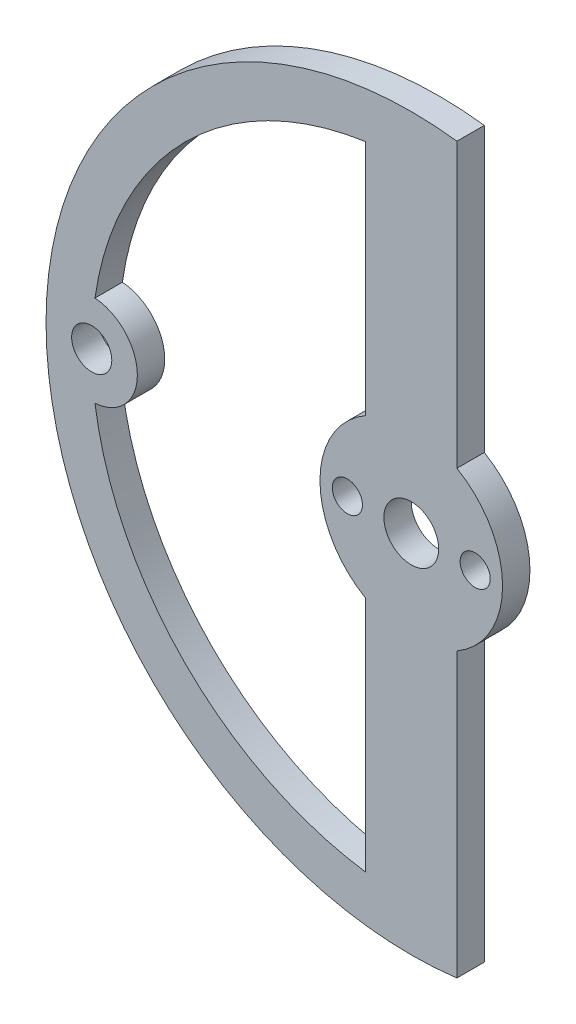
ISO-10303-21;
HEADER;
FILE_DESCRIPTION(('STEP AP214'),'2;1');
FILE_NAME('part.step','',(''),(''),'','','');
FILE_SCHEMA(('AUTOMOTIVE_DESIGN { 1 0 10303 214 1 1 1 1 }'));
ENDSEC;
DATA;
#1=APPLICATION_CONTEXT('core data for automotive mechanical design processes');
#2=APPLICATION_PROTOCOL_DEFINITION('international standard','automotive_design',2000,#1);
#3=PRODUCT_CONTEXT('',#1,'mechanical');
#4=PRODUCT('Part','Part','',(#3));
#5=PRODUCT_RELATED_PRODUCT_CATEGORY('part','',(#4));
#6=PRODUCT_DEFINITION_FORMATION('','',#4);
#7=PRODUCT_DEFINITION_CONTEXT('part definition',#1,'design');
#8=PRODUCT_DEFINITION('design','',#6,#7);
#9=PRODUCT_DEFINITION_SHAPE('','',#8);
#10=(LENGTH_UNIT() NAMED_UNIT(*) SI_UNIT(.MILLI.,.METRE.));
#11=(NAMED_UNIT(*) PLANE_ANGLE_UNIT() SI_UNIT($,.RADIAN.));
#12=(NAMED_UNIT(*) SI_UNIT($,.STERADIAN.) SOLID_ANGLE_UNIT());
#13=UNCERTAINTY_MEASURE_WITH_UNIT(LENGTH_MEASURE(1.E-05),#10,'distance_accuracy_value','');
#14=(GEOMETRIC_REPRESENTATION_CONTEXT(3) GLOBAL_UNCERTAINTY_ASSIGNED_CONTEXT((#13)) GLOBAL_UNIT_ASSIGNED_CONTEXT((#10,
#11,#12)) REPRESENTATION_CONTEXT('',''));
#15=CARTESIAN_POINT('',(0.,0.,0.));
#16=DIRECTION('',(0.,0.,1.));
#17=DIRECTION('',(1.,0.,0.));
#18=AXIS2_PLACEMENT_3D('',#15,#16,#17);
#19=CARTESIAN_POINT('',(5.,0.,3.));
#20=DIRECTION('',(-1.,0.,0.));
#21=DIRECTION('',(0.,0.,1.));
#22=AXIS2_PLACEMENT_3D('',#19,#20,#21);
#23=PLANE('',#22);
#24=DIRECTION('',(0.,1.,0.));
#25=VECTOR('',#24,1.);
#26=CARTESIAN_POINT('',(5.,0.,0.));
#27=LINE('',#26,#25);
#28=CARTESIAN_POINT('',(5.,-39.6862696659689,0.));
#29=VERTEX_POINT('',#28);
#30=CARTESIAN_POINT('',(5.,-8.66025403784439,0.));
#31=VERTEX_POINT('',#30);
#32=EDGE_CURVE('E59',#29,#31,#27,.T.);
#33=ORIENTED_EDGE('',*,*,#32,.T.);
#34=DIRECTION('',(0.,0.,-1.));
#35=VECTOR('',#34,1.);
#36=CARTESIAN_POINT('',(5.,-8.66025403784439,3.));
#37=LINE('',#36,#35);
#38=CARTESIAN_POINT('',(5.,-8.66025403784439,3.));
#39=VERTEX_POINT('',#38);
#40=EDGE_CURVE('E11',#39,#31,#37,.T.);
#41=ORIENTED_EDGE('',*,*,#40,.F.);
#42=DIRECTION('',(0.,1.,0.));
#43=VECTOR('',#42,1.);
#44=CARTESIAN_POINT('',(5.,0.,3.));
#45=LINE('',#44,#43);
#46=CARTESIAN_POINT('',(5.,-39.6862696659689,3.));
#47=VERTEX_POINT('',#46);
#48=EDGE_CURVE('E149',#47,#39,#45,.T.);
#49=ORIENTED_EDGE('',*,*,#48,.F.);
#50=DIRECTION('',(0.,0.,1.));
#51=VECTOR('',#50,1.);
#52=CARTESIAN_POINT('',(5.,-39.6862696659689,-7.));
#53=LINE('',#52,#51);
#54=EDGE_CURVE('E172',#29,#47,#53,.T.);
#55=ORIENTED_EDGE('',*,*,#54,.F.);
#56=EDGE_LOOP('',(#33,#41,#49,#55));
#57=FACE_BOUND('',#56,.T.);
#58=ADVANCED_FACE('F41',(#57),#23,.F.);
#59=CARTESIAN_POINT('',(0.,0.,3.));
#60=DIRECTION('',(0.,0.,-1.));
#61=DIRECTION('',(-1.,0.,0.));
#62=AXIS2_PLACEMENT_3D('',#59,#60,#61);
#63=CYLINDRICAL_SURFACE('',#62,10.);
#64=CARTESIAN_POINT('',(0.,0.,0.));
#65=DIRECTION('',(0.,0.,1.));
#66=DIRECTION('',(1.,0.,0.));
#67=AXIS2_PLACEMENT_3D('',#64,#65,#66);
#68=CIRCLE('',#67,10.);
#69=CARTESIAN_POINT('',(5.,8.66025403784439,0.));
#70=VERTEX_POINT('',#69);
#71=EDGE_CURVE('E98',#31,#70,#68,.T.);
#72=ORIENTED_EDGE('',*,*,#71,.T.);
#73=DIRECTION('',(0.,0.,-1.));
#74=VECTOR('',#73,1.);
#75=CARTESIAN_POINT('',(5.,8.66025403784439,3.));
#76=LINE('',#75,#74);
#77=CARTESIAN_POINT('',(5.,8.66025403784439,3.));
#78=VERTEX_POINT('',#77);
#79=EDGE_CURVE('E51',#78,#70,#76,.T.);
#80=ORIENTED_EDGE('',*,*,#79,.F.);
#81=CARTESIAN_POINT('',(0.,0.,3.));
#82=DIRECTION('',(0.,0.,1.));
#83=DIRECTION('',(1.,0.,0.));
#84=AXIS2_PLACEMENT_3D('',#81,#82,#83);
#85=CIRCLE('',#84,10.);
#86=EDGE_CURVE('E68',#39,#78,#85,.T.);
#87=ORIENTED_EDGE('',*,*,#86,.F.);
#88=ORIENTED_EDGE('',*,*,#40,.T.);
#89=EDGE_LOOP('',(#72,#80,#87,#88));
#90=FACE_BOUND('',#89,.T.);
#91=ADVANCED_FACE('F269',(#90),#63,.T.);
#92=CARTESIAN_POINT('',(5.,0.,3.));
#93=DIRECTION('',(-1.,0.,0.));
#94=DIRECTION('',(0.,0.,1.));
#95=AXIS2_PLACEMENT_3D('',#92,#93,#94);
#96=PLANE('',#95);
#97=DIRECTION('',(0.,1.,0.));
#98=VECTOR('',#97,1.);
#99=CARTESIAN_POINT('',(5.,0.,0.));
#100=LINE('',#99,#98);
#101=CARTESIAN_POINT('',(5.,39.6862696659689,0.));
#102=VERTEX_POINT('',#101);
#103=EDGE_CURVE('E208',#70,#102,#100,.T.);
#104=ORIENTED_EDGE('',*,*,#103,.T.);
#105=DIRECTION('',(0.,0.,1.));
#106=VECTOR('',#105,1.);
#107=CARTESIAN_POINT('',(5.,39.6862696659689,-7.));
#108=LINE('',#107,#106);
#109=CARTESIAN_POINT('',(5.,39.6862696659689,3.));
#110=VERTEX_POINT('',#109);
#111=EDGE_CURVE('E168',#102,#110,#108,.T.);
#112=ORIENTED_EDGE('',*,*,#111,.T.);
#113=DIRECTION('',(0.,1.,0.));
#114=VECTOR('',#113,1.);
#115=CARTESIAN_POINT('',(5.,0.,3.));
#116=LINE('',#115,#114);
#117=EDGE_CURVE('E304',#78,#110,#116,.T.);
#118=ORIENTED_EDGE('',*,*,#117,.F.);
#119=ORIENTED_EDGE('',*,*,#79,.T.);
#120=EDGE_LOOP('',(#104,#112,#118,#119));
#121=FACE_BOUND('',#120,.T.);
#122=ADVANCED_FACE('F274',(#121),#96,.F.);
#123=CARTESIAN_POINT('',(-5.,0.,3.));
#124=DIRECTION('',(-1.,0.,0.));
#125=DIRECTION('',(0.,0.,1.));
#126=AXIS2_PLACEMENT_3D('',#123,#124,#125);
#127=PLANE('',#126);
#128=DIRECTION('',(0.,1.,0.));
#129=VECTOR('',#128,1.);
#130=CARTESIAN_POINT('',(-5.,0.,0.));
#131=LINE('',#130,#129);
#132=CARTESIAN_POINT('',(-5.,8.66025403784439,0.));
#133=VERTEX_POINT('',#132);
#134=CARTESIAN_POINT('',(-5.,34.6410161513776,0.));
#135=VERTEX_POINT('',#134);
#136=EDGE_CURVE('E175',#133,#135,#131,.T.);
#137=ORIENTED_EDGE('',*,*,#136,.F.);
#138=DIRECTION('',(0.,0.,-1.));
#139=VECTOR('',#138,1.);
#140=CARTESIAN_POINT('',(-5.,8.66025403784439,3.));
#141=LINE('',#140,#139);
#142=CARTESIAN_POINT('',(-5.,8.66025403784439,3.));
#143=VERTEX_POINT('',#142);
#144=EDGE_CURVE('E45',#143,#133,#141,.T.);
#145=ORIENTED_EDGE('',*,*,#144,.F.);
#146=DIRECTION('',(0.,1.,0.));
#147=VECTOR('',#146,1.);
#148=CARTESIAN_POINT('',(-5.,0.,3.));
#149=LINE('',#148,#147);
#150=CARTESIAN_POINT('',(-5.,34.6410161513776,3.));
#151=VERTEX_POINT('',#150);
#152=EDGE_CURVE('E136',#143,#151,#149,.T.);
#153=ORIENTED_EDGE('',*,*,#152,.T.);
#154=DIRECTION('',(0.,0.,-1.));
#155=VECTOR('',#154,1.);
#156=CARTESIAN_POINT('',(-5.,34.6410161513776,3.));
#157=LINE('',#156,#155);
#158=EDGE_CURVE('E124',#151,#135,#157,.T.);
#159=ORIENTED_EDGE('',*,*,#158,.T.);
#160=EDGE_LOOP('',(#137,#145,#153,#159));
#161=FACE_BOUND('',#160,.T.);
#162=ADVANCED_FACE('F43',(#161),#127,.T.);
#163=CARTESIAN_POINT('',(0.,0.,3.));
#164=DIRECTION('',(0.,0.,-1.));
#165=DIRECTION('',(-1.,0.,0.));
#166=AXIS2_PLACEMENT_3D('',#163,#164,#165);
#167=CYLINDRICAL_SURFACE('',#166,10.);
#168=CARTESIAN_POINT('',(0.,0.,0.));
#169=DIRECTION('',(0.,0.,1.));
#170=DIRECTION('',(1.,0.,0.));
#171=AXIS2_PLACEMENT_3D('',#168,#169,#170);
#172=CIRCLE('',#171,10.);
#173=CARTESIAN_POINT('',(-5.,-8.66025403784439,0.));
#174=VERTEX_POINT('',#173);
#175=EDGE_CURVE('E182',#133,#174,#172,.T.);
#176=ORIENTED_EDGE('',*,*,#175,.T.);
#177=DIRECTION('',(0.,0.,-1.));
#178=VECTOR('',#177,1.);
#179=CARTESIAN_POINT('',(-5.,-8.66025403784439,3.));
#180=LINE('',#179,#178);
#181=CARTESIAN_POINT('',(-5.,-8.66025403784439,3.));
#182=VERTEX_POINT('',#181);
#183=EDGE_CURVE('E239',#182,#174,#180,.T.);
#184=ORIENTED_EDGE('',*,*,#183,.F.);
#185=CARTESIAN_POINT('',(0.,0.,3.));
#186=DIRECTION('',(0.,0.,1.));
#187=DIRECTION('',(1.,0.,0.));
#188=AXIS2_PLACEMENT_3D('',#185,#186,#187);
#189=CIRCLE('',#188,10.);
#190=EDGE_CURVE('E139',#143,#182,#189,.T.);
#191=ORIENTED_EDGE('',*,*,#190,.F.);
#192=ORIENTED_EDGE('',*,*,#144,.T.);
#193=EDGE_LOOP('',(#176,#184,#191,#192));
#194=FACE_BOUND('',#193,.T.);
#195=ADVANCED_FACE('F245',(#194),#167,.T.);
#196=CARTESIAN_POINT('',(-5.,0.,3.));
#197=DIRECTION('',(-1.,0.,0.));
#198=DIRECTION('',(0.,0.,1.));
#199=AXIS2_PLACEMENT_3D('',#196,#197,#198);
#200=PLANE('',#199);
#201=DIRECTION('',(0.,1.,0.));
#202=VECTOR('',#201,1.);
#203=CARTESIAN_POINT('',(-5.,0.,0.));
#204=LINE('',#203,#202);
#205=CARTESIAN_POINT('',(-5.,-34.6410161513776,0.));
#206=VERTEX_POINT('',#205);
#207=EDGE_CURVE('E188',#206,#174,#204,.T.);
#208=ORIENTED_EDGE('',*,*,#207,.F.);
#209=DIRECTION('',(0.,0.,-1.));
#210=VECTOR('',#209,1.);
#211=CARTESIAN_POINT('',(-5.,-34.6410161513776,3.));
#212=LINE('',#211,#210);
#213=CARTESIAN_POINT('',(-5.,-34.6410161513776,3.));
#214=VERTEX_POINT('',#213);
#215=EDGE_CURVE('E237',#214,#206,#212,.T.);
#216=ORIENTED_EDGE('',*,*,#215,.F.);
#217=DIRECTION('',(0.,1.,0.));
#218=VECTOR('',#217,1.);
#219=CARTESIAN_POINT('',(-5.,0.,3.));
#220=LINE('',#219,#218);
#221=EDGE_CURVE('E159',#214,#182,#220,.T.);
#222=ORIENTED_EDGE('',*,*,#221,.T.);
#223=ORIENTED_EDGE('',*,*,#183,.T.);
#224=EDGE_LOOP('',(#208,#216,#222,#223));
#225=FACE_BOUND('',#224,.T.);
#226=ADVANCED_FACE('F250',(#225),#200,.T.);
#227=CARTESIAN_POINT('',(0.,0.,3.));
#228=DIRECTION('',(0.,0.,-1.));
#229=DIRECTION('',(-1.,0.,0.));
#230=AXIS2_PLACEMENT_3D('',#227,#228,#229);
#231=CYLINDRICAL_SURFACE('',#230,35.);
#232=CARTESIAN_POINT('',(0.,0.,0.));
#233=DIRECTION('',(0.,0.,1.));
#234=DIRECTION('',(1.,0.,0.));
#235=AXIS2_PLACEMENT_3D('',#232,#233,#234);
#236=CIRCLE('',#235,35.);
#237=CARTESIAN_POINT('',(-34.6428571428572,-4.98722858706033,0.));
#238=VERTEX_POINT('',#237);
#239=EDGE_CURVE('E196',#238,#206,#236,.T.);
#240=ORIENTED_EDGE('',*,*,#239,.F.);
#241=DIRECTION('',(0.,0.,-1.));
#242=VECTOR('',#241,1.);
#243=CARTESIAN_POINT('',(-34.6428571428572,-4.98722858706033,3.));
#244=LINE('',#243,#242);
#245=CARTESIAN_POINT('',(-34.6428571428572,-4.98722858706033,3.));
#246=VERTEX_POINT('',#245);
#247=EDGE_CURVE('E234',#246,#238,#244,.T.);
#248=ORIENTED_EDGE('',*,*,#247,.F.);
#249=CARTESIAN_POINT('',(0.,0.,3.));
#250=DIRECTION('',(0.,0.,1.));
#251=DIRECTION('',(1.,0.,0.));
#252=AXIS2_PLACEMENT_3D('',#249,#250,#251);
#253=CIRCLE('',#252,35.);
#254=EDGE_CURVE('E151',#246,#214,#253,.T.);
#255=ORIENTED_EDGE('',*,*,#254,.T.);
#256=ORIENTED_EDGE('',*,*,#215,.T.);
#257=EDGE_LOOP('',(#240,#248,#255,#256));
#258=FACE_BOUND('',#257,.T.);
#259=ADVANCED_FACE('F251',(#258),#231,.F.);
#260=CARTESIAN_POINT('',(-35.,0.,3.));
#261=DIRECTION('',(0.,0.,-1.));
#262=DIRECTION('',(-1.,0.,0.));
#263=AXIS2_PLACEMENT_3D('',#260,#261,#262);
#264=CYLINDRICAL_SURFACE('',#263,4.99999999999999);
#265=CARTESIAN_POINT('',(-35.,0.,0.));
#266=DIRECTION('',(0.,0.,1.));
#267=DIRECTION('',(1.,0.,0.));
#268=AXIS2_PLACEMENT_3D('',#265,#266,#267);
#269=CIRCLE('',#268,4.99999999999999);
#270=CARTESIAN_POINT('',(-34.6428571428572,4.98722858706033,0.));
#271=VERTEX_POINT('',#270);
#272=EDGE_CURVE('E200',#238,#271,#269,.T.);
#273=ORIENTED_EDGE('',*,*,#272,.T.);
#274=DIRECTION('',(0.,0.,-1.));
#275=VECTOR('',#274,1.);
#276=CARTESIAN_POINT('',(-34.6428571428572,4.98722858706033,3.));
#277=LINE('',#276,#275);
#278=CARTESIAN_POINT('',(-34.6428571428572,4.98722858706033,3.));
#279=VERTEX_POINT('',#278);
#280=EDGE_CURVE('E132',#279,#271,#277,.T.);
#281=ORIENTED_EDGE('',*,*,#280,.F.);
#282=CARTESIAN_POINT('',(-35.,0.,3.));
#283=DIRECTION('',(0.,0.,1.));
#284=DIRECTION('',(1.,0.,0.));
#285=AXIS2_PLACEMENT_3D('',#282,#283,#284);
#286=CIRCLE('',#285,4.99999999999999);
#287=EDGE_CURVE('E146',#246,#279,#286,.T.);
#288=ORIENTED_EDGE('',*,*,#287,.F.);
#289=ORIENTED_EDGE('',*,*,#247,.T.);
#290=EDGE_LOOP('',(#273,#281,#288,#289));
#291=FACE_BOUND('',#290,.T.);
#292=ADVANCED_FACE('F253',(#291),#264,.T.);
#293=CARTESIAN_POINT('',(-7.,0.,3.));
#294=DIRECTION('',(0.,0.,-1.));
#295=DIRECTION('',(-1.,0.,0.));
#296=AXIS2_PLACEMENT_3D('',#293,#294,#295);
#297=CYLINDRICAL_SURFACE('',#296,1.65);
#298=CARTESIAN_POINT('',(-7.,0.,3.));
#299=DIRECTION('',(0.,0.,1.));
#300=DIRECTION('',(1.,0.,0.));
#301=AXIS2_PLACEMENT_3D('',#298,#299,#300);
#302=CIRCLE('',#301,1.65);
#303=CARTESIAN_POINT('',(-5.35,0.,3.));
#304=VERTEX_POINT('',#303);
#305=EDGE_CURVE('E313',#304,#304,#302,.T.);
#306=ORIENTED_EDGE('',*,*,#305,.T.);
#307=EDGE_LOOP('',(#306));
#308=FACE_BOUND('',#307,.T.);
#309=CARTESIAN_POINT('',(-7.,0.,0.));
#310=DIRECTION('',(0.,0.,1.));
#311=DIRECTION('',(1.,0.,0.));
#312=AXIS2_PLACEMENT_3D('',#309,#310,#311);
#313=CIRCLE('',#312,1.65);
#314=CARTESIAN_POINT('',(-5.35,0.,0.));
#315=VERTEX_POINT('',#314);
#316=EDGE_CURVE('E223',#315,#315,#313,.T.);
#317=ORIENTED_EDGE('',*,*,#316,.F.);
#318=EDGE_LOOP('',(#317));
#319=FACE_BOUND('',#318,.T.);
#320=ADVANCED_FACE('F256',(#308,#319),#297,.F.);
#321=CARTESIAN_POINT('',(0.,0.,3.));
#322=DIRECTION('',(0.,0.,-1.));
#323=DIRECTION('',(-1.,0.,0.));
#324=AXIS2_PLACEMENT_3D('',#321,#322,#323);
#325=CYLINDRICAL_SURFACE('',#324,3.);
#326=CARTESIAN_POINT('',(0.,0.,3.));
#327=DIRECTION('',(0.,0.,1.));
#328=DIRECTION('',(1.,0.,0.));
#329=AXIS2_PLACEMENT_3D('',#326,#327,#328);
#330=CIRCLE('',#329,3.);
#331=CARTESIAN_POINT('',(3.,0.,3.));
#332=VERTEX_POINT('',#331);
#333=EDGE_CURVE('E307',#332,#332,#330,.T.);
#334=ORIENTED_EDGE('',*,*,#333,.T.);
#335=EDGE_LOOP('',(#334));
#336=FACE_BOUND('',#335,.T.);
#337=CARTESIAN_POINT('',(0.,0.,0.));
#338=DIRECTION('',(0.,0.,1.));
#339=DIRECTION('',(1.,0.,0.));
#340=AXIS2_PLACEMENT_3D('',#337,#338,#339);
#341=CIRCLE('',#340,3.);
#342=CARTESIAN_POINT('',(3.,0.,0.));
#343=VERTEX_POINT('',#342);
#344=EDGE_CURVE('E219',#343,#343,#341,.T.);
#345=ORIENTED_EDGE('',*,*,#344,.F.);
#346=EDGE_LOOP('',(#345));
#347=FACE_BOUND('',#346,.T.);
#348=ADVANCED_FACE('F262',(#336,#347),#325,.F.);
#349=CARTESIAN_POINT('',(0.,0.,3.));
#350=DIRECTION('',(0.,0.,-1.));
#351=DIRECTION('',(-1.,0.,0.));
#352=AXIS2_PLACEMENT_3D('',#349,#350,#351);
#353=CYLINDRICAL_SURFACE('',#352,40.);
#354=CARTESIAN_POINT('',(0.,0.,0.));
#355=DIRECTION('',(0.,0.,1.));
#356=DIRECTION('',(1.,0.,0.));
#357=AXIS2_PLACEMENT_3D('',#354,#355,#356);
#358=CIRCLE('',#357,40.);
#359=EDGE_CURVE('E216',#102,#29,#358,.T.);
#360=ORIENTED_EDGE('',*,*,#359,.T.);
#361=ORIENTED_EDGE('',*,*,#54,.T.);
#362=CARTESIAN_POINT('',(0.,0.,3.));
#363=DIRECTION('',(0.,0.,1.));
#364=DIRECTION('',(1.,0.,0.));
#365=AXIS2_PLACEMENT_3D('',#362,#363,#364);
#366=CIRCLE('',#365,40.);
#367=EDGE_CURVE('E299',#110,#47,#366,.T.);
#368=ORIENTED_EDGE('',*,*,#367,.F.);
#369=ORIENTED_EDGE('',*,*,#111,.F.);
#370=EDGE_LOOP('',(#360,#361,#368,#369));
#371=FACE_BOUND('',#370,.T.);
#372=ADVANCED_FACE('F283',(#371),#353,.T.);
#373=CARTESIAN_POINT('',(-35.,0.,3.));
#374=DIRECTION('',(0.,0.,-1.));
#375=DIRECTION('',(-1.,0.,0.));
#376=AXIS2_PLACEMENT_3D('',#373,#374,#375);
#377=CYLINDRICAL_SURFACE('',#376,2.2);
#378=CARTESIAN_POINT('',(-35.,0.,3.));
#379=DIRECTION('',(0.,0.,1.));
#380=DIRECTION('',(1.,0.,0.));
#381=AXIS2_PLACEMENT_3D('',#378,#379,#380);
#382=CIRCLE('',#381,2.2);
#383=CARTESIAN_POINT('',(-32.8,0.,3.));
#384=VERTEX_POINT('',#383);
#385=EDGE_CURVE('E308',#384,#384,#382,.T.);
#386=ORIENTED_EDGE('',*,*,#385,.T.);
#387=EDGE_LOOP('',(#386));
#388=FACE_BOUND('',#387,.T.);
#389=CARTESIAN_POINT('',(-35.,0.,0.));
#390=DIRECTION('',(0.,0.,1.));
#391=DIRECTION('',(1.,0.,0.));
#392=AXIS2_PLACEMENT_3D('',#389,#390,#391);
#393=CIRCLE('',#392,2.2);
#394=CARTESIAN_POINT('',(-32.8,0.,0.));
#395=VERTEX_POINT('',#394);
#396=EDGE_CURVE('E212',#395,#395,#393,.T.);
#397=ORIENTED_EDGE('',*,*,#396,.F.);
#398=EDGE_LOOP('',(#397));
#399=FACE_BOUND('',#398,.T.);
#400=ADVANCED_FACE('F280',(#388,#399),#377,.F.);
#401=EDGE_CURVE('E129',#135,#271,#236,.T.);
#402=ORIENTED_EDGE('',*,*,#401,.F.);
#403=ORIENTED_EDGE('',*,*,#158,.F.);
#404=EDGE_CURVE('E127',#151,#279,#253,.T.);
#405=ORIENTED_EDGE('',*,*,#404,.T.);
#406=ORIENTED_EDGE('',*,*,#280,.T.);
#407=EDGE_LOOP('',(#402,#403,#405,#406));
#408=FACE_BOUND('',#407,.T.);
#409=ADVANCED_FACE('F125',(#408),#231,.F.);
#410=CARTESIAN_POINT('',(7.,0.,3.));
#411=DIRECTION('',(0.,0.,-1.));
#412=DIRECTION('',(-1.,0.,0.));
#413=AXIS2_PLACEMENT_3D('',#410,#411,#412);
#414=CYLINDRICAL_SURFACE('',#413,1.65);
#415=CARTESIAN_POINT('',(7.,0.,3.));
#416=DIRECTION('',(0.,0.,1.));
#417=DIRECTION('',(1.,0.,0.));
#418=AXIS2_PLACEMENT_3D('',#415,#416,#417);
#419=CIRCLE('',#418,1.65);
#420=CARTESIAN_POINT('',(8.65,0.,3.));
#421=VERTEX_POINT('',#420);
#422=EDGE_CURVE('E133',#421,#421,#419,.T.);
#423=ORIENTED_EDGE('',*,*,#422,.T.);
#424=EDGE_LOOP('',(#423));
#425=FACE_BOUND('',#424,.T.);
#426=CARTESIAN_POINT('',(7.,0.,0.));
#427=DIRECTION('',(0.,0.,1.));
#428=DIRECTION('',(1.,0.,0.));
#429=AXIS2_PLACEMENT_3D('',#426,#427,#428);
#430=CIRCLE('',#429,1.65);
#431=CARTESIAN_POINT('',(8.65,0.,0.));
#432=VERTEX_POINT('',#431);
#433=EDGE_CURVE('E140',#432,#432,#430,.T.);
#434=ORIENTED_EDGE('',*,*,#433,.F.);
#435=EDGE_LOOP('',(#434));
#436=FACE_BOUND('',#435,.T.);
#437=ADVANCED_FACE('F290',(#425,#436),#414,.F.);
#438=CARTESIAN_POINT('',(0.,0.,3.));
#439=DIRECTION('',(0.,0.,1.));
#440=DIRECTION('',(1.,0.,0.));
#441=AXIS2_PLACEMENT_3D('',#438,#439,#440);
#442=PLANE('',#441);
#443=ORIENTED_EDGE('',*,*,#367,.T.);
#444=ORIENTED_EDGE('',*,*,#48,.T.);
#445=ORIENTED_EDGE('',*,*,#86,.T.);
#446=ORIENTED_EDGE('',*,*,#117,.T.);
#447=EDGE_LOOP('',(#443,#444,#445,#446));
#448=FACE_BOUND('',#447,.T.);
#449=ORIENTED_EDGE('',*,*,#152,.F.);
#450=ORIENTED_EDGE('',*,*,#190,.T.);
#451=ORIENTED_EDGE('',*,*,#221,.F.);
#452=ORIENTED_EDGE('',*,*,#254,.F.);
#453=ORIENTED_EDGE('',*,*,#287,.T.);
#454=ORIENTED_EDGE('',*,*,#404,.F.);
#455=EDGE_LOOP('',(#449,#450,#451,#452,#453,#454));
#456=FACE_BOUND('',#455,.T.);
#457=ORIENTED_EDGE('',*,*,#385,.F.);
#458=EDGE_LOOP('',(#457));
#459=FACE_BOUND('',#458,.T.);
#460=ORIENTED_EDGE('',*,*,#333,.F.);
#461=EDGE_LOOP('',(#460));
#462=FACE_BOUND('',#461,.T.);
#463=ORIENTED_EDGE('',*,*,#305,.F.);
#464=EDGE_LOOP('',(#463));
#465=FACE_BOUND('',#464,.T.);
#466=ORIENTED_EDGE('',*,*,#422,.F.);
#467=EDGE_LOOP('',(#466));
#468=FACE_BOUND('',#467,.T.);
#469=ADVANCED_FACE('F142',(#448,#456,#459,#462,#465,#468),#442,.T.);
#470=CARTESIAN_POINT('',(0.,0.,0.));
#471=DIRECTION('',(0.,0.,1.));
#472=DIRECTION('',(1.,0.,0.));
#473=AXIS2_PLACEMENT_3D('',#470,#471,#472);
#474=PLANE('',#473);
#475=ORIENTED_EDGE('',*,*,#136,.T.);
#476=ORIENTED_EDGE('',*,*,#401,.T.);
#477=ORIENTED_EDGE('',*,*,#272,.F.);
#478=ORIENTED_EDGE('',*,*,#239,.T.);
#479=ORIENTED_EDGE('',*,*,#207,.T.);
#480=ORIENTED_EDGE('',*,*,#175,.F.);
#481=EDGE_LOOP('',(#475,#476,#477,#478,#479,#480));
#482=FACE_BOUND('',#481,.T.);
#483=ORIENTED_EDGE('',*,*,#396,.T.);
#484=EDGE_LOOP('',(#483));
#485=FACE_BOUND('',#484,.T.);
#486=ORIENTED_EDGE('',*,*,#32,.F.);
#487=ORIENTED_EDGE('',*,*,#359,.F.);
#488=ORIENTED_EDGE('',*,*,#103,.F.);
#489=ORIENTED_EDGE('',*,*,#71,.F.);
#490=EDGE_LOOP('',(#486,#487,#488,#489));
#491=FACE_BOUND('',#490,.T.);
#492=ORIENTED_EDGE('',*,*,#344,.T.);
#493=EDGE_LOOP('',(#492));
#494=FACE_BOUND('',#493,.T.);
#495=ORIENTED_EDGE('',*,*,#316,.T.);
#496=EDGE_LOOP('',(#495));
#497=FACE_BOUND('',#496,.T.);
#498=ORIENTED_EDGE('',*,*,#433,.T.);
#499=EDGE_LOOP('',(#498));
#500=FACE_BOUND('',#499,.T.);
#501=ADVANCED_FACE('F246',(#482,#485,#491,#494,#497,#500),#474,.F.);
#502=CLOSED_SHELL('',(#58,#91,#122,#162,#195,#226,#259,#292,#320,#348,#372,#400,#409,#437,#469,#501));
#503=MANIFOLD_SOLID_BREP('B2',#502);
#504=ADVANCED_BREP_SHAPE_REPRESENTATION('',(#18,#503),#14);
#505=SHAPE_DEFINITION_REPRESENTATION(#9,#504);
ENDSEC;
END-ISO-10303-21;
